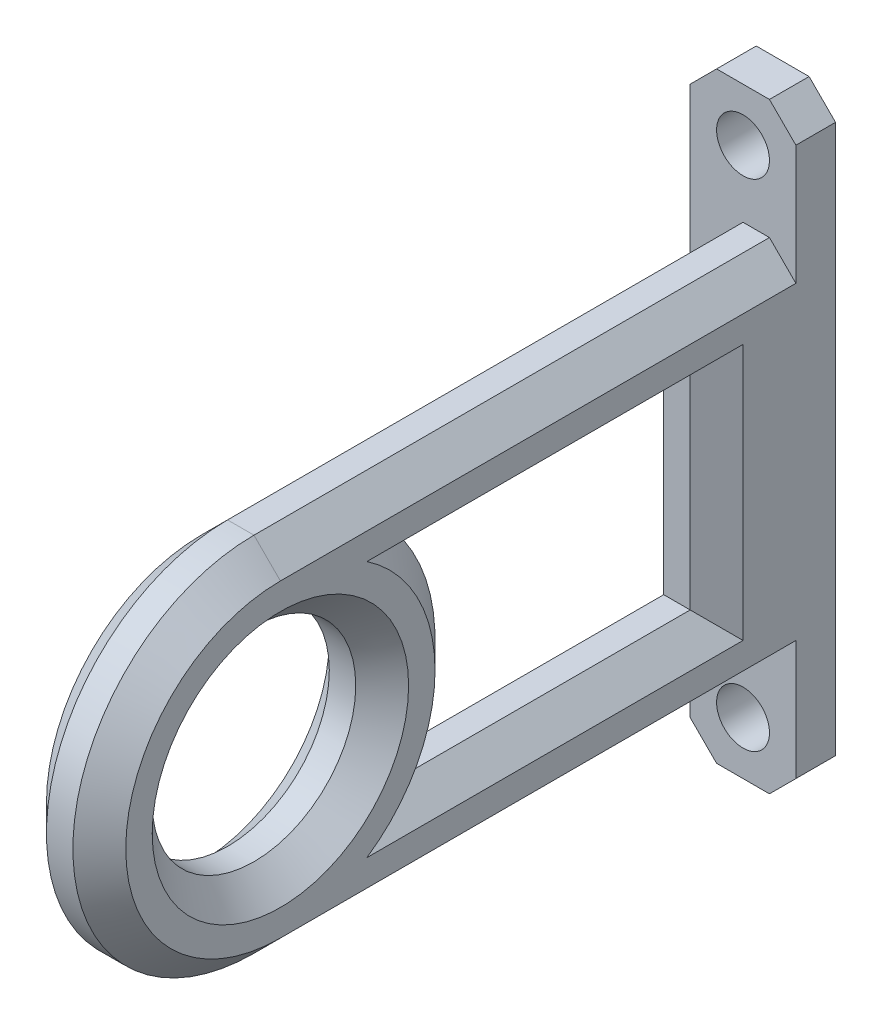
ISO-10303-21;
HEADER;
FILE_DESCRIPTION(('STEP AP214'),'2;1');
FILE_NAME('part.step','',(''),(''),'','','');
FILE_SCHEMA(('AUTOMOTIVE_DESIGN { 1 0 10303 214 1 1 1 1 }'));
ENDSEC;
DATA;
#1=APPLICATION_CONTEXT('core data for automotive mechanical design processes');
#2=APPLICATION_PROTOCOL_DEFINITION('international standard','automotive_design',2000,#1);
#3=PRODUCT_CONTEXT('',#1,'mechanical');
#4=PRODUCT('Part','Part','',(#3));
#5=PRODUCT_RELATED_PRODUCT_CATEGORY('part','',(#4));
#6=PRODUCT_DEFINITION_FORMATION('','',#4);
#7=PRODUCT_DEFINITION_CONTEXT('part definition',#1,'design');
#8=PRODUCT_DEFINITION('design','',#6,#7);
#9=PRODUCT_DEFINITION_SHAPE('','',#8);
#10=(LENGTH_UNIT() NAMED_UNIT(*) SI_UNIT(.MILLI.,.METRE.));
#11=(NAMED_UNIT(*) PLANE_ANGLE_UNIT() SI_UNIT($,.RADIAN.));
#12=(NAMED_UNIT(*) SI_UNIT($,.STERADIAN.) SOLID_ANGLE_UNIT());
#13=UNCERTAINTY_MEASURE_WITH_UNIT(LENGTH_MEASURE(1.E-05),#10,'distance_accuracy_value','');
#14=(GEOMETRIC_REPRESENTATION_CONTEXT(3) GLOBAL_UNCERTAINTY_ASSIGNED_CONTEXT((#13)) GLOBAL_UNIT_ASSIGNED_CONTEXT((#10,
#11,#12)) REPRESENTATION_CONTEXT('',''));
#15=CARTESIAN_POINT('',(0.,0.,0.));
#16=DIRECTION('',(0.,0.,1.));
#17=DIRECTION('',(1.,0.,0.));
#18=AXIS2_PLACEMENT_3D('',#15,#16,#17);
#19=CARTESIAN_POINT('',(6.,0.,0.));
#20=DIRECTION('',(1.,0.,0.));
#21=DIRECTION('',(0.,0.,-1.));
#22=AXIS2_PLACEMENT_3D('',#19,#20,#21);
#23=PLANE('',#22);
#24=CARTESIAN_POINT('',(6.,0.,0.));
#25=DIRECTION('',(1.,0.,0.));
#26=DIRECTION('',(0.,0.,-1.));
#27=AXIS2_PLACEMENT_3D('',#24,#25,#26);
#28=CIRCLE('',#27,9.70000000000024);
#29=CARTESIAN_POINT('',(6.,0.,-9.70000000000024));
#30=VERTEX_POINT('',#29);
#31=EDGE_CURVE('E209',#30,#30,#28,.F.);
#32=ORIENTED_EDGE('',*,*,#31,.T.);
#33=EDGE_LOOP('',(#32));
#34=FACE_BOUND('',#33,.T.);
#35=DIRECTION('',(0.,0.,1.));
#36=VECTOR('',#35,1.);
#37=CARTESIAN_POINT('',(6.,-9.70000000000157,-1.52204206480904E-13));
#38=LINE('',#37,#36);
#39=CARTESIAN_POINT('',(6.,-9.70000000000103,-34.9999999999993));
#40=VERTEX_POINT('',#39);
#41=CARTESIAN_POINT('',(6.,-9.70000000000147,-6.54217089351876));
#42=VERTEX_POINT('',#41);
#43=EDGE_CURVE('E474',#40,#42,#38,.T.);
#44=ORIENTED_EDGE('',*,*,#43,.T.);
#45=CARTESIAN_POINT('',(6.,0.,0.));
#46=DIRECTION('',(1.,0.,0.));
#47=DIRECTION('',(0.,0.,-1.));
#48=AXIS2_PLACEMENT_3D('',#45,#46,#47);
#49=CIRCLE('',#48,11.7000000000014);
#50=CARTESIAN_POINT('',(6.,9.70000000000147,-6.54217089351876));
#51=VERTEX_POINT('',#50);
#52=EDGE_CURVE('E476',#42,#51,#49,.T.);
#53=ORIENTED_EDGE('',*,*,#52,.T.);
#54=DIRECTION('',(0.,0.,-1.));
#55=VECTOR('',#54,1.);
#56=CARTESIAN_POINT('',(6.,9.70000000000157,-1.52204206480904E-13));
#57=LINE('',#56,#55);
#58=CARTESIAN_POINT('',(6.,9.70000000000103,-34.9999999999993));
#59=VERTEX_POINT('',#58);
#60=EDGE_CURVE('E243',#51,#59,#57,.T.);
#61=ORIENTED_EDGE('',*,*,#60,.T.);
#62=DIRECTION('',(0.,-1.,0.));
#63=VECTOR('',#62,1.);
#64=CARTESIAN_POINT('',(6.,0.,-34.9999999999993));
#65=LINE('',#64,#63);
#66=EDGE_CURVE('E472',#59,#40,#65,.T.);
#67=ORIENTED_EDGE('',*,*,#66,.T.);
#68=EDGE_LOOP('',(#44,#53,#61,#67));
#69=FACE_BOUND('',#68,.T.);
#70=DIRECTION('',(0.,-1.,0.));
#71=VECTOR('',#70,1.);
#72=CARTESIAN_POINT('',(6.,-22.7499999999908,-38.9999999999993));
#73=LINE('',#72,#71);
#74=CARTESIAN_POINT('',(6.,-11.7000000000011,-38.9999999999993));
#75=VERTEX_POINT('',#74);
#76=CARTESIAN_POINT('',(6.,-20.7499999999908,-38.9999999999993));
#77=VERTEX_POINT('',#76);
#78=EDGE_CURVE('E226',#75,#77,#73,.T.);
#79=ORIENTED_EDGE('',*,*,#78,.T.);
#80=DIRECTION('',(0.,0.,-1.));
#81=VECTOR('',#80,1.);
#82=CARTESIAN_POINT('',(6.,-20.7499999999908,-41.9999999999993));
#83=LINE('',#82,#81);
#84=CARTESIAN_POINT('',(6.,-20.7499999999908,-41.9999999999993));
#85=VERTEX_POINT('',#84);
#86=EDGE_CURVE('E719',#77,#85,#83,.T.);
#87=ORIENTED_EDGE('',*,*,#86,.T.);
#88=DIRECTION('',(0.,-1.,0.));
#89=VECTOR('',#88,1.);
#90=CARTESIAN_POINT('',(6.,-22.7499999999908,-41.9999999999993));
#91=LINE('',#90,#89);
#92=CARTESIAN_POINT('',(6.00000000000001,20.7499999999908,-41.9999999999993));
#93=VERTEX_POINT('',#92);
#94=EDGE_CURVE('E688',#93,#85,#91,.T.);
#95=ORIENTED_EDGE('',*,*,#94,.F.);
#96=DIRECTION('',(0.,0.,1.));
#97=VECTOR('',#96,1.);
#98=CARTESIAN_POINT('',(6.,20.7499999999908,-38.9999999999993));
#99=LINE('',#98,#97);
#100=CARTESIAN_POINT('',(6.00000000000001,20.7499999999908,-38.9999999999993));
#101=VERTEX_POINT('',#100);
#102=EDGE_CURVE('E716',#93,#101,#99,.T.);
#103=ORIENTED_EDGE('',*,*,#102,.T.);
#104=CARTESIAN_POINT('',(6.,11.7000000000011,-38.9999999999993));
#105=VERTEX_POINT('',#104);
#106=EDGE_CURVE('E703',#101,#105,#73,.T.);
#107=ORIENTED_EDGE('',*,*,#106,.T.);
#108=DIRECTION('',(0.,0.,1.));
#109=VECTOR('',#108,1.);
#110=CARTESIAN_POINT('',(6.,11.7000000000009,0.));
#111=LINE('',#110,#109);
#112=CARTESIAN_POINT('',(6.,11.7000000000009,0.));
#113=VERTEX_POINT('',#112);
#114=EDGE_CURVE('E248',#105,#113,#111,.T.);
#115=ORIENTED_EDGE('',*,*,#114,.T.);
#116=CARTESIAN_POINT('',(6.,0.,0.));
#117=DIRECTION('',(1.,0.,0.));
#118=DIRECTION('',(0.,0.,-1.));
#119=AXIS2_PLACEMENT_3D('',#116,#117,#118);
#120=CIRCLE('',#119,11.7000000000009);
#121=CARTESIAN_POINT('',(6.,-11.7000000000009,0.));
#122=VERTEX_POINT('',#121);
#123=EDGE_CURVE('E244',#113,#122,#120,.T.);
#124=ORIENTED_EDGE('',*,*,#123,.T.);
#125=DIRECTION('',(0.,0.,-1.));
#126=VECTOR('',#125,1.);
#127=CARTESIAN_POINT('',(6.,-11.7000000000011,-38.9999999999993));
#128=LINE('',#127,#126);
#129=EDGE_CURVE('E241',#122,#75,#128,.T.);
#130=ORIENTED_EDGE('',*,*,#129,.T.);
#131=EDGE_LOOP('',(#79,#87,#95,#103,#107,#115,#124,#130));
#132=FACE_BOUND('',#131,.T.);
#133=ADVANCED_FACE('F35',(#34,#69,#132),#23,.T.);
#134=CARTESIAN_POINT('',(0.,0.,0.));
#135=DIRECTION('',(1.,0.,0.));
#136=DIRECTION('',(0.,0.,-1.));
#137=AXIS2_PLACEMENT_3D('',#134,#135,#136);
#138=PLANE('',#137);
#139=CARTESIAN_POINT('',(0.,0.,0.));
#140=DIRECTION('',(1.,0.,0.));
#141=DIRECTION('',(0.,0.,-1.));
#142=AXIS2_PLACEMENT_3D('',#139,#140,#141);
#143=CIRCLE('',#142,9.70000000000022);
#144=CARTESIAN_POINT('',(0.,0.,-9.70000000000022));
#145=VERTEX_POINT('',#144);
#146=EDGE_CURVE('E461',#145,#145,#143,.T.);
#147=ORIENTED_EDGE('',*,*,#146,.T.);
#148=EDGE_LOOP('',(#147));
#149=FACE_BOUND('',#148,.T.);
#150=CARTESIAN_POINT('',(0.,0.,0.));
#151=DIRECTION('',(1.,0.,0.));
#152=DIRECTION('',(0.,0.,-1.));
#153=AXIS2_PLACEMENT_3D('',#150,#151,#152);
#154=CIRCLE('',#153,11.7000000000014);
#155=CARTESIAN_POINT('',(0.,9.70000000000146,-6.54217089351881));
#156=VERTEX_POINT('',#155);
#157=CARTESIAN_POINT('',(0.,-9.70000000000146,-6.54217089351881));
#158=VERTEX_POINT('',#157);
#159=EDGE_CURVE('E451',#156,#158,#154,.F.);
#160=ORIENTED_EDGE('',*,*,#159,.T.);
#161=DIRECTION('',(0.,0.,-1.));
#162=VECTOR('',#161,1.);
#163=CARTESIAN_POINT('',(0.,-9.70000000000105,-32.9999999999994));
#164=LINE('',#163,#162);
#165=CARTESIAN_POINT('',(0.,-9.70000000000102,-34.9999999999993));
#166=VERTEX_POINT('',#165);
#167=EDGE_CURVE('E453',#158,#166,#164,.T.);
#168=ORIENTED_EDGE('',*,*,#167,.T.);
#169=DIRECTION('',(0.,1.,0.));
#170=VECTOR('',#169,1.);
#171=CARTESIAN_POINT('',(0.,7.70000000000106,-34.9999999999993));
#172=LINE('',#171,#170);
#173=CARTESIAN_POINT('',(0.,9.70000000000102,-34.9999999999993));
#174=VERTEX_POINT('',#173);
#175=EDGE_CURVE('E449',#166,#174,#172,.T.);
#176=ORIENTED_EDGE('',*,*,#175,.T.);
#177=DIRECTION('',(0.,0.,1.));
#178=VECTOR('',#177,1.);
#179=CARTESIAN_POINT('',(0.,9.70000000000139,-11.331372379373));
#180=LINE('',#179,#178);
#181=EDGE_CURVE('E447',#174,#156,#180,.T.);
#182=ORIENTED_EDGE('',*,*,#181,.T.);
#183=EDGE_LOOP('',(#160,#168,#176,#182));
#184=FACE_BOUND('',#183,.T.);
#185=DIRECTION('',(0.,1.,0.));
#186=VECTOR('',#185,1.);
#187=CARTESIAN_POINT('',(0.,-13.7000000000011,-38.9999999999993));
#188=LINE('',#187,#186);
#189=CARTESIAN_POINT('',(0.,-11.7000000000011,-38.9999999999993));
#190=VERTEX_POINT('',#189);
#191=CARTESIAN_POINT('',(0.,11.7000000000011,-38.9999999999993));
#192=VERTEX_POINT('',#191);
#193=EDGE_CURVE('E432',#190,#192,#188,.T.);
#194=ORIENTED_EDGE('',*,*,#193,.F.);
#195=DIRECTION('',(0.,0.,1.));
#196=VECTOR('',#195,1.);
#197=CARTESIAN_POINT('',(0.,-11.7000000000009,0.));
#198=LINE('',#197,#196);
#199=CARTESIAN_POINT('',(0.,-11.7000000000009,0.));
#200=VERTEX_POINT('',#199);
#201=EDGE_CURVE('E459',#190,#200,#198,.T.);
#202=ORIENTED_EDGE('',*,*,#201,.T.);
#203=CARTESIAN_POINT('',(0.,0.,0.));
#204=DIRECTION('',(1.,0.,0.));
#205=DIRECTION('',(0.,0.,-1.));
#206=AXIS2_PLACEMENT_3D('',#203,#204,#205);
#207=CIRCLE('',#206,11.7000000000009);
#208=CARTESIAN_POINT('',(0.,11.7000000000009,0.));
#209=VERTEX_POINT('',#208);
#210=EDGE_CURVE('E457',#200,#209,#207,.F.);
#211=ORIENTED_EDGE('',*,*,#210,.T.);
#212=DIRECTION('',(0.,0.,-1.));
#213=VECTOR('',#212,1.);
#214=CARTESIAN_POINT('',(0.,11.7000000000009,0.));
#215=LINE('',#214,#213);
#216=EDGE_CURVE('E430',#209,#192,#215,.T.);
#217=ORIENTED_EDGE('',*,*,#216,.T.);
#218=EDGE_LOOP('',(#194,#202,#211,#217));
#219=FACE_BOUND('',#218,.T.);
#220=ADVANCED_FACE('F381',(#149,#184,#219),#138,.F.);
#221=CARTESIAN_POINT('',(6.,0.,0.));
#222=DIRECTION('',(-1.,0.,0.));
#223=DIRECTION('',(0.,0.,1.));
#224=AXIS2_PLACEMENT_3D('',#221,#222,#223);
#225=CYLINDRICAL_SURFACE('',#224,13.7000000000009);
#226=DIRECTION('',(-1.,0.,0.));
#227=VECTOR('',#226,1.);
#228=CARTESIAN_POINT('',(6.,13.7000000000009,0.));
#229=LINE('',#228,#227);
#230=CARTESIAN_POINT('',(4.00000000000001,13.7000000000009,0.));
#231=VERTEX_POINT('',#230);
#232=CARTESIAN_POINT('',(1.99999999999999,13.7000000000009,0.));
#233=VERTEX_POINT('',#232);
#234=EDGE_CURVE('E435',#231,#233,#229,.T.);
#235=ORIENTED_EDGE('',*,*,#234,.T.);
#236=CARTESIAN_POINT('',(1.99999999999999,0.,0.));
#237=DIRECTION('',(1.,0.,0.));
#238=DIRECTION('',(0.,0.,-1.));
#239=AXIS2_PLACEMENT_3D('',#236,#237,#238);
#240=CIRCLE('',#239,13.7000000000009);
#241=CARTESIAN_POINT('',(1.99999999999999,-13.7000000000009,0.));
#242=VERTEX_POINT('',#241);
#243=EDGE_CURVE('E256',#233,#242,#240,.T.);
#244=ORIENTED_EDGE('',*,*,#243,.T.);
#245=DIRECTION('',(-1.,0.,0.));
#246=VECTOR('',#245,1.);
#247=CARTESIAN_POINT('',(6.,-13.7000000000009,0.));
#248=LINE('',#247,#246);
#249=CARTESIAN_POINT('',(4.00000000000001,-13.7000000000009,0.));
#250=VERTEX_POINT('',#249);
#251=EDGE_CURVE('E218',#250,#242,#248,.T.);
#252=ORIENTED_EDGE('',*,*,#251,.F.);
#253=CARTESIAN_POINT('',(4.00000000000001,0.,0.));
#254=DIRECTION('',(1.,0.,0.));
#255=DIRECTION('',(0.,0.,-1.));
#256=AXIS2_PLACEMENT_3D('',#253,#254,#255);
#257=CIRCLE('',#256,13.7000000000009);
#258=EDGE_CURVE('E254',#250,#231,#257,.F.);
#259=ORIENTED_EDGE('',*,*,#258,.T.);
#260=EDGE_LOOP('',(#235,#244,#252,#259));
#261=FACE_BOUND('',#260,.T.);
#262=ADVANCED_FACE('F387',(#261),#225,.T.);
#263=CARTESIAN_POINT('',(6.,-13.7000000000009,0.));
#264=DIRECTION('',(0.,1.,0.));
#265=DIRECTION('',(0.,0.,1.));
#266=AXIS2_PLACEMENT_3D('',#263,#264,#265);
#267=PLANE('',#266);
#268=ORIENTED_EDGE('',*,*,#251,.T.);
#269=DIRECTION('',(0.,0.,-1.));
#270=VECTOR('',#269,1.);
#271=CARTESIAN_POINT('',(1.99999999999999,-13.7000000000009,0.));
#272=LINE('',#271,#270);
#273=CARTESIAN_POINT('',(2.,-13.7000000000011,-38.9999999999993));
#274=VERTEX_POINT('',#273);
#275=EDGE_CURVE('E208',#242,#274,#272,.T.);
#276=ORIENTED_EDGE('',*,*,#275,.T.);
#277=DIRECTION('',(-1.,0.,0.));
#278=VECTOR('',#277,1.);
#279=CARTESIAN_POINT('',(6.,-13.7000000000011,-38.9999999999993));
#280=LINE('',#279,#278);
#281=CARTESIAN_POINT('',(4.00000000000001,-13.7000000000011,-38.9999999999993));
#282=VERTEX_POINT('',#281);
#283=EDGE_CURVE('E213',#282,#274,#280,.T.);
#284=ORIENTED_EDGE('',*,*,#283,.F.);
#285=DIRECTION('',(0.,0.,1.));
#286=VECTOR('',#285,1.);
#287=CARTESIAN_POINT('',(4.00000000000001,-13.7000000000009,0.));
#288=LINE('',#287,#286);
#289=EDGE_CURVE('E196',#282,#250,#288,.T.);
#290=ORIENTED_EDGE('',*,*,#289,.T.);
#291=EDGE_LOOP('',(#268,#276,#284,#290));
#292=FACE_BOUND('',#291,.T.);
#293=ADVANCED_FACE('F214',(#292),#267,.F.);
#294=CARTESIAN_POINT('',(6.,13.7000000000009,0.));
#295=DIRECTION('',(0.,-1.,0.));
#296=DIRECTION('',(0.,0.,-1.));
#297=AXIS2_PLACEMENT_3D('',#294,#295,#296);
#298=PLANE('',#297);
#299=DIRECTION('',(-1.,0.,0.));
#300=VECTOR('',#299,1.);
#301=CARTESIAN_POINT('',(6.,13.7000000000011,-38.9999999999993));
#302=LINE('',#301,#300);
#303=CARTESIAN_POINT('',(4.00000000000001,13.7000000000011,-38.9999999999993));
#304=VERTEX_POINT('',#303);
#305=CARTESIAN_POINT('',(2.,13.7000000000011,-38.9999999999993));
#306=VERTEX_POINT('',#305);
#307=EDGE_CURVE('E219',#304,#306,#302,.T.);
#308=ORIENTED_EDGE('',*,*,#307,.T.);
#309=DIRECTION('',(0.,0.,1.));
#310=VECTOR('',#309,1.);
#311=CARTESIAN_POINT('',(1.99999999999999,13.7000000000009,0.));
#312=LINE('',#311,#310);
#313=EDGE_CURVE('E260',#306,#233,#312,.T.);
#314=ORIENTED_EDGE('',*,*,#313,.T.);
#315=ORIENTED_EDGE('',*,*,#234,.F.);
#316=DIRECTION('',(0.,0.,-1.));
#317=VECTOR('',#316,1.);
#318=CARTESIAN_POINT('',(4.00000000000001,13.7000000000011,-38.9999999999993));
#319=LINE('',#318,#317);
#320=EDGE_CURVE('E258',#231,#304,#319,.T.);
#321=ORIENTED_EDGE('',*,*,#320,.T.);
#322=EDGE_LOOP('',(#308,#314,#315,#321));
#323=FACE_BOUND('',#322,.T.);
#324=ADVANCED_FACE('F396',(#323),#298,.F.);
#325=CARTESIAN_POINT('',(6.,-7.70000000000106,-32.9999999999993));
#326=DIRECTION('',(0.,0.,1.));
#327=DIRECTION('',(1.,0.,0.));
#328=AXIS2_PLACEMENT_3D('',#325,#326,#327);
#329=PLANE('',#328);
#330=DIRECTION('',(-1.,0.,0.));
#331=VECTOR('',#330,1.);
#332=CARTESIAN_POINT('',(6.,7.70000000000106,-32.9999999999993));
#333=LINE('',#332,#331);
#334=CARTESIAN_POINT('',(4.00000000000001,7.70000000000106,-32.9999999999993));
#335=VERTEX_POINT('',#334);
#336=CARTESIAN_POINT('',(1.99999999999999,7.70000000000106,-32.9999999999993));
#337=VERTEX_POINT('',#336);
#338=EDGE_CURVE('E436',#335,#337,#333,.T.);
#339=ORIENTED_EDGE('',*,*,#338,.T.);
#340=DIRECTION('',(0.,-1.,0.));
#341=VECTOR('',#340,1.);
#342=CARTESIAN_POINT('',(1.99999999999999,-7.70000000000106,-32.9999999999993));
#343=LINE('',#342,#341);
#344=CARTESIAN_POINT('',(1.99999999999999,-7.70000000000106,-32.9999999999993));
#345=VERTEX_POINT('',#344);
#346=EDGE_CURVE('E274',#337,#345,#343,.T.);
#347=ORIENTED_EDGE('',*,*,#346,.T.);
#348=DIRECTION('',(-1.,0.,0.));
#349=VECTOR('',#348,1.);
#350=CARTESIAN_POINT('',(6.,-7.70000000000106,-32.9999999999993));
#351=LINE('',#350,#349);
#352=CARTESIAN_POINT('',(4.00000000000001,-7.70000000000106,-32.9999999999993));
#353=VERTEX_POINT('',#352);
#354=EDGE_CURVE('E288',#353,#345,#351,.T.);
#355=ORIENTED_EDGE('',*,*,#354,.F.);
#356=DIRECTION('',(0.,1.,0.));
#357=VECTOR('',#356,1.);
#358=CARTESIAN_POINT('',(4.00000000000001,-7.70000000000106,-32.9999999999993));
#359=LINE('',#358,#357);
#360=EDGE_CURVE('E272',#353,#335,#359,.T.);
#361=ORIENTED_EDGE('',*,*,#360,.T.);
#362=EDGE_LOOP('',(#339,#347,#355,#361));
#363=FACE_BOUND('',#362,.T.);
#364=ADVANCED_FACE('F393',(#363),#329,.T.);
#365=CARTESIAN_POINT('',(6.,7.7000000000014,-11.331372379373));
#366=DIRECTION('',(0.,-1.,0.));
#367=DIRECTION('',(0.,0.,-1.));
#368=AXIS2_PLACEMENT_3D('',#365,#366,#367);
#369=PLANE('',#368);
#370=DIRECTION('',(-1.,0.,0.));
#371=VECTOR('',#370,1.);
#372=CARTESIAN_POINT('',(6.,7.7000000000014,-11.331372379373));
#373=LINE('',#372,#371);
#374=CARTESIAN_POINT('',(4.00000000000001,7.7000000000014,-11.331372379373));
#375=VERTEX_POINT('',#374);
#376=CARTESIAN_POINT('',(1.99999999999999,7.7000000000014,-11.331372379373));
#377=VERTEX_POINT('',#376);
#378=EDGE_CURVE('E441',#375,#377,#373,.T.);
#379=ORIENTED_EDGE('',*,*,#378,.T.);
#380=DIRECTION('',(0.,0.,-1.));
#381=VECTOR('',#380,1.);
#382=CARTESIAN_POINT('',(1.99999999999999,7.70000000000106,-32.9999999999993));
#383=LINE('',#382,#381);
#384=EDGE_CURVE('E278',#377,#337,#383,.T.);
#385=ORIENTED_EDGE('',*,*,#384,.T.);
#386=ORIENTED_EDGE('',*,*,#338,.F.);
#387=DIRECTION('',(0.,0.,1.));
#388=VECTOR('',#387,1.);
#389=CARTESIAN_POINT('',(4.00000000000001,7.7000000000014,-11.331372379373));
#390=LINE('',#389,#388);
#391=EDGE_CURVE('E276',#335,#375,#390,.T.);
#392=ORIENTED_EDGE('',*,*,#391,.T.);
#393=EDGE_LOOP('',(#379,#385,#386,#392));
#394=FACE_BOUND('',#393,.T.);
#395=ADVANCED_FACE('F498',(#394),#369,.T.);
#396=CARTESIAN_POINT('',(6.,0.,0.));
#397=DIRECTION('',(-1.,0.,0.));
#398=DIRECTION('',(0.,0.,1.));
#399=AXIS2_PLACEMENT_3D('',#396,#397,#398);
#400=CYLINDRICAL_SURFACE('',#399,13.7000000000014);
#401=DIRECTION('',(-1.,0.,0.));
#402=VECTOR('',#401,1.);
#403=CARTESIAN_POINT('',(6.,-7.7000000000014,-11.331372379373));
#404=LINE('',#403,#402);
#405=CARTESIAN_POINT('',(4.00000000000001,-7.7000000000014,-11.331372379373));
#406=VERTEX_POINT('',#405);
#407=CARTESIAN_POINT('',(1.99999999999999,-7.7000000000014,-11.331372379373));
#408=VERTEX_POINT('',#407);
#409=EDGE_CURVE('E512',#406,#408,#404,.T.);
#410=ORIENTED_EDGE('',*,*,#409,.T.);
#411=CARTESIAN_POINT('',(1.99999999999999,0.,0.));
#412=DIRECTION('',(1.,0.,0.));
#413=DIRECTION('',(0.,0.,-1.));
#414=AXIS2_PLACEMENT_3D('',#411,#412,#413);
#415=CIRCLE('',#414,13.7000000000014);
#416=EDGE_CURVE('E270',#408,#377,#415,.T.);
#417=ORIENTED_EDGE('',*,*,#416,.T.);
#418=ORIENTED_EDGE('',*,*,#378,.F.);
#419=CARTESIAN_POINT('',(4.00000000000001,0.,0.));
#420=DIRECTION('',(1.,0.,0.));
#421=DIRECTION('',(0.,0.,-1.));
#422=AXIS2_PLACEMENT_3D('',#419,#420,#421);
#423=CIRCLE('',#422,13.7000000000014);
#424=EDGE_CURVE('E267',#375,#406,#423,.F.);
#425=ORIENTED_EDGE('',*,*,#424,.T.);
#426=EDGE_LOOP('',(#410,#417,#418,#425));
#427=FACE_BOUND('',#426,.T.);
#428=ADVANCED_FACE('F490',(#427),#400,.T.);
#429=CARTESIAN_POINT('',(6.,-7.7000000000014,-11.331372379373));
#430=DIRECTION('',(0.,1.,0.));
#431=DIRECTION('',(0.,0.,1.));
#432=AXIS2_PLACEMENT_3D('',#429,#430,#431);
#433=PLANE('',#432);
#434=ORIENTED_EDGE('',*,*,#354,.T.);
#435=DIRECTION('',(0.,0.,1.));
#436=VECTOR('',#435,1.);
#437=CARTESIAN_POINT('',(1.99999999999999,-7.7000000000014,-11.331372379373));
#438=LINE('',#437,#436);
#439=EDGE_CURVE('E264',#345,#408,#438,.T.);
#440=ORIENTED_EDGE('',*,*,#439,.T.);
#441=ORIENTED_EDGE('',*,*,#409,.F.);
#442=DIRECTION('',(0.,0.,-1.));
#443=VECTOR('',#442,1.);
#444=CARTESIAN_POINT('',(4.00000000000001,-7.7000000000014,-11.331372379373));
#445=LINE('',#444,#443);
#446=EDGE_CURVE('E262',#406,#353,#445,.T.);
#447=ORIENTED_EDGE('',*,*,#446,.T.);
#448=EDGE_LOOP('',(#434,#440,#441,#447));
#449=FACE_BOUND('',#448,.T.);
#450=ADVANCED_FACE('F484',(#449),#433,.T.);
#451=CARTESIAN_POINT('',(6.,0.,0.));
#452=DIRECTION('',(-1.,0.,0.));
#453=DIRECTION('',(0.,0.,1.));
#454=AXIS2_PLACEMENT_3D('',#451,#452,#453);
#455=CYLINDRICAL_SURFACE('',#454,7.70000000000023);
#456=CARTESIAN_POINT('',(1.99999999999999,0.,0.));
#457=DIRECTION('',(1.,0.,0.));
#458=DIRECTION('',(0.,0.,-1.));
#459=AXIS2_PLACEMENT_3D('',#456,#457,#458);
#460=CIRCLE('',#459,7.70000000000023);
#461=CARTESIAN_POINT('',(1.99999999999999,0.,-7.70000000000023));
#462=VERTEX_POINT('',#461);
#463=EDGE_CURVE('E467',#462,#462,#460,.F.);
#464=ORIENTED_EDGE('',*,*,#463,.T.);
#465=EDGE_LOOP('',(#464));
#466=FACE_BOUND('',#465,.T.);
#467=CARTESIAN_POINT('',(4.,0.,0.));
#468=DIRECTION('',(1.,0.,0.));
#469=DIRECTION('',(0.,0.,-1.));
#470=AXIS2_PLACEMENT_3D('',#467,#468,#469);
#471=CIRCLE('',#470,7.70000000000023);
#472=CARTESIAN_POINT('',(4.,0.,-7.70000000000023));
#473=VERTEX_POINT('',#472);
#474=EDGE_CURVE('E464',#473,#473,#471,.T.);
#475=ORIENTED_EDGE('',*,*,#474,.T.);
#476=EDGE_LOOP('',(#475));
#477=FACE_BOUND('',#476,.T.);
#478=ADVANCED_FACE('F409',(#466,#477),#455,.F.);
#479=CARTESIAN_POINT('',(0.,0.,0.));
#480=DIRECTION('',(-1.,0.,0.));
#481=DIRECTION('',(0.,0.,1.));
#482=AXIS2_PLACEMENT_3D('',#479,#480,#481);
#483=CONICAL_SURFACE('',#482,9.70000000000022,0.785398163397446);
#484=ORIENTED_EDGE('',*,*,#463,.F.);
#485=EDGE_LOOP('',(#484));
#486=FACE_BOUND('',#485,.T.);
#487=ORIENTED_EDGE('',*,*,#146,.F.);
#488=EDGE_LOOP('',(#487));
#489=FACE_BOUND('',#488,.T.);
#490=ADVANCED_FACE('F405',(#486,#489),#483,.F.);
#491=CARTESIAN_POINT('',(4.,0.,0.));
#492=DIRECTION('',(1.,0.,0.));
#493=DIRECTION('',(0.,0.,-1.));
#494=AXIS2_PLACEMENT_3D('',#491,#492,#493);
#495=CONICAL_SURFACE('',#494,7.70000000000023,0.78539816339745);
#496=ORIENTED_EDGE('',*,*,#31,.F.);
#497=EDGE_LOOP('',(#496));
#498=FACE_BOUND('',#497,.T.);
#499=ORIENTED_EDGE('',*,*,#474,.F.);
#500=EDGE_LOOP('',(#499));
#501=FACE_BOUND('',#500,.T.);
#502=ADVANCED_FACE('F408',(#498,#501),#495,.F.);
#503=CARTESIAN_POINT('',(1.99999999999999,13.7000000000009,0.));
#504=DIRECTION('',(0.707106781186549,-0.707106781186546,0.));
#505=DIRECTION('',(0.,0.,1.));
#506=AXIS2_PLACEMENT_3D('',#503,#504,#505);
#507=PLANE('',#506);
#508=DIRECTION('',(-0.707106781186546,-0.707106781186549,0.));
#509=VECTOR('',#508,1.);
#510=CARTESIAN_POINT('',(1.9999999999999,13.700000000001,-38.9999999999993));
#511=LINE('',#510,#509);
#512=EDGE_CURVE('E227',#192,#306,#511,.F.);
#513=ORIENTED_EDGE('',*,*,#512,.F.);
#514=ORIENTED_EDGE('',*,*,#216,.F.);
#515=DIRECTION('',(-0.707106781186546,-0.707106781186549,0.));
#516=VECTOR('',#515,1.);
#517=CARTESIAN_POINT('',(1.99999999999999,13.7000000000009,0.));
#518=LINE('',#517,#516);
#519=EDGE_CURVE('E284',#233,#209,#518,.T.);
#520=ORIENTED_EDGE('',*,*,#519,.F.);
#521=ORIENTED_EDGE('',*,*,#313,.F.);
#522=EDGE_LOOP('',(#513,#514,#520,#521));
#523=FACE_BOUND('',#522,.T.);
#524=ADVANCED_FACE('F413',(#523),#507,.F.);
#525=CARTESIAN_POINT('',(1.99999999999999,0.,0.));
#526=DIRECTION('',(1.,0.,0.));
#527=DIRECTION('',(0.,0.,-1.));
#528=AXIS2_PLACEMENT_3D('',#525,#526,#527);
#529=CONICAL_SURFACE('',#528,13.7000000000009,0.78539816339745);
#530=ORIENTED_EDGE('',*,*,#519,.T.);
#531=ORIENTED_EDGE('',*,*,#210,.F.);
#532=DIRECTION('',(-0.707106781186546,0.707106781186549,0.));
#533=VECTOR('',#532,1.);
#534=CARTESIAN_POINT('',(1.99999999999999,-13.7000000000009,0.));
#535=LINE('',#534,#533);
#536=EDGE_CURVE('E281',#242,#200,#535,.T.);
#537=ORIENTED_EDGE('',*,*,#536,.F.);
#538=ORIENTED_EDGE('',*,*,#243,.F.);
#539=EDGE_LOOP('',(#530,#531,#537,#538));
#540=FACE_BOUND('',#539,.T.);
#541=ADVANCED_FACE('F417',(#540),#529,.T.);
#542=CARTESIAN_POINT('',(1.99999999999999,-13.7000000000009,0.));
#543=DIRECTION('',(0.707106781186549,0.707106781186546,0.));
#544=DIRECTION('',(0.,0.,-1.));
#545=AXIS2_PLACEMENT_3D('',#542,#543,#544);
#546=PLANE('',#545);
#547=ORIENTED_EDGE('',*,*,#536,.T.);
#548=ORIENTED_EDGE('',*,*,#201,.F.);
#549=DIRECTION('',(0.707106781186546,-0.707106781186549,0.));
#550=VECTOR('',#549,1.);
#551=CARTESIAN_POINT('',(1.9999999999999,-13.700000000001,-38.9999999999993));
#552=LINE('',#551,#550);
#553=EDGE_CURVE('E231',#274,#190,#552,.F.);
#554=ORIENTED_EDGE('',*,*,#553,.F.);
#555=ORIENTED_EDGE('',*,*,#275,.F.);
#556=EDGE_LOOP('',(#547,#548,#554,#555));
#557=FACE_BOUND('',#556,.T.);
#558=ADVANCED_FACE('F327',(#557),#546,.F.);
#559=CARTESIAN_POINT('',(0.,9.70000000000156,-1.52204206480904E-13));
#560=DIRECTION('',(-0.707106781186546,-0.707106781186549,0.));
#561=DIRECTION('',(0.,0.,-1.));
#562=AXIS2_PLACEMENT_3D('',#559,#560,#561);
#563=PLANE('',#562);
#564=DIRECTION('',(0.57735026918963,-0.577350269189619,0.577350269189628));
#565=VECTOR('',#564,1.);
#566=CARTESIAN_POINT('',(3.23333333333366,6.46666666666742,-31.7666666666657));
#567=LINE('',#566,#565);
#568=EDGE_CURVE('E299',#337,#174,#567,.F.);
#569=ORIENTED_EDGE('',*,*,#568,.F.);
#570=ORIENTED_EDGE('',*,*,#384,.F.);
#571=CARTESIAN_POINT('',(1.99999999999999,7.7000000000014,-11.331372379373));
#572=CARTESIAN_POINT('',(1.80288845972015,7.89711154028125,-10.9590613292886));
#573=CARTESIAN_POINT('',(1.61190901569892,8.08809098430248,-10.5800856138893));
#574=CARTESIAN_POINT('',(1.24494844146939,8.45505155853202,-9.80978926894103));
#575=CARTESIAN_POINT('',(1.06891829491808,8.63108170508334,-9.4185152435259));
#576=CARTESIAN_POINT('',(0.733093161650863,8.96690683835057,-8.62177800678088));
#577=CARTESIAN_POINT('',(0.573310044504791,9.12668995549665,-8.21630470854151));
#578=CARTESIAN_POINT('',(0.272066238857046,9.4279337611444,-7.39023917497787));
#579=CARTESIAN_POINT('',(0.130670314920811,9.56932968508064,-6.96959982740123));
#580=CARTESIAN_POINT('',(0.,9.70000000000146,-6.54217089351881));
#581=B_SPLINE_CURVE_WITH_KNOTS('',3,(#571,#572,#573,#574,#575,#576,#577,#578,#579,#580),
.UNSPECIFIED.,.F.,.F.,(4,2,2,2,4),(0.,1.39538108798869,2.78599446863604,4.17761659659731,
5.5740147691987),.UNSPECIFIED.);
#582=EDGE_CURVE('E285',#156,#377,#581,.F.);
#583=ORIENTED_EDGE('',*,*,#582,.F.);
#584=ORIENTED_EDGE('',*,*,#181,.F.);
#585=EDGE_LOOP('',(#569,#570,#583,#584));
#586=FACE_BOUND('',#585,.T.);
#587=ADVANCED_FACE('F309',(#586),#563,.T.);
#588=CARTESIAN_POINT('',(0.,0.,0.));
#589=DIRECTION('',(1.,0.,0.));
#590=DIRECTION('',(0.,0.,-1.));
#591=AXIS2_PLACEMENT_3D('',#588,#589,#590);
#592=CONICAL_SURFACE('',#591,11.7000000000014,0.785398163397447);
#593=ORIENTED_EDGE('',*,*,#582,.T.);
#594=ORIENTED_EDGE('',*,*,#416,.F.);
#595=CARTESIAN_POINT('',(1.99999999999999,-7.7000000000014,-11.331372379373));
#596=CARTESIAN_POINT('',(1.80288845972015,-7.89711154028125,-10.9590613292886));
#597=CARTESIAN_POINT('',(1.61190901569892,-8.08809098430249,-10.5800856138893));
#598=CARTESIAN_POINT('',(1.24494844146939,-8.45505155853202,-9.80978926894102));
#599=CARTESIAN_POINT('',(1.06891829491808,-8.63108170508333,-9.4185152435259));
#600=CARTESIAN_POINT('',(0.733093161650863,-8.96690683835057,-8.62177800678088));
#601=CARTESIAN_POINT('',(0.573310044504791,-9.12668995549665,-8.21630470854151));
#602=CARTESIAN_POINT('',(0.272066238857046,-9.4279337611444,-7.39023917497787));
#603=CARTESIAN_POINT('',(0.130670314920811,-9.56932968508064,-6.96959982740123));
#604=CARTESIAN_POINT('',(0.,-9.70000000000146,-6.54217089351881));
#605=B_SPLINE_CURVE_WITH_KNOTS('',3,(#595,#596,#597,#598,#599,#600,#601,#602,#603,#604),
.UNSPECIFIED.,.F.,.F.,(4,2,2,2,4),(0.,1.39538108798868,2.78599446863604,4.1776165965973,
5.57401476919869),.UNSPECIFIED.);
#606=EDGE_CURVE('E291',#158,#408,#605,.F.);
#607=ORIENTED_EDGE('',*,*,#606,.F.);
#608=ORIENTED_EDGE('',*,*,#159,.F.);
#609=EDGE_LOOP('',(#593,#594,#607,#608));
#610=FACE_BOUND('',#609,.T.);
#611=ADVANCED_FACE('F304',(#610),#592,.T.);
#612=CARTESIAN_POINT('',(0.,0.,-34.9999999999993));
#613=DIRECTION('',(-0.707106781186546,0.,0.707106781186549));
#614=DIRECTION('',(0.,-1.,0.));
#615=AXIS2_PLACEMENT_3D('',#612,#613,#614);
#616=PLANE('',#615);
#617=ORIENTED_EDGE('',*,*,#568,.T.);
#618=ORIENTED_EDGE('',*,*,#175,.F.);
#619=DIRECTION('',(0.57735026918963,0.577350269189619,0.577350269189628));
#620=VECTOR('',#619,1.);
#621=CARTESIAN_POINT('',(11.6666666666663,1.9666666666651,-23.333333333333));
#622=LINE('',#621,#620);
#623=EDGE_CURVE('E289',#345,#166,#622,.F.);
#624=ORIENTED_EDGE('',*,*,#623,.F.);
#625=ORIENTED_EDGE('',*,*,#346,.F.);
#626=EDGE_LOOP('',(#617,#618,#624,#625));
#627=FACE_BOUND('',#626,.T.);
#628=ADVANCED_FACE('F308',(#627),#616,.T.);
#629=CARTESIAN_POINT('',(0.,-9.70000000000156,-1.52204206480904E-13));
#630=DIRECTION('',(-0.707106781186546,0.707106781186549,0.));
#631=DIRECTION('',(0.,0.,1.));
#632=AXIS2_PLACEMENT_3D('',#629,#630,#631);
#633=PLANE('',#632);
#634=ORIENTED_EDGE('',*,*,#606,.T.);
#635=ORIENTED_EDGE('',*,*,#439,.F.);
#636=ORIENTED_EDGE('',*,*,#623,.T.);
#637=ORIENTED_EDGE('',*,*,#167,.F.);
#638=EDGE_LOOP('',(#634,#635,#636,#637));
#639=FACE_BOUND('',#638,.T.);
#640=ADVANCED_FACE('F301',(#639),#633,.T.);
#641=CARTESIAN_POINT('',(4.00000000000001,-7.70000000000106,-32.9999999999993));
#642=DIRECTION('',(-0.707106781186549,0.,-0.707106781186546));
#643=DIRECTION('',(0.,1.,0.));
#644=AXIS2_PLACEMENT_3D('',#641,#642,#643);
#645=PLANE('',#644);
#646=DIRECTION('',(0.577350269189627,-0.57735026918962,-0.57735026918963));
#647=VECTOR('',#646,1.);
#648=CARTESIAN_POINT('',(-3.22287587354207,-0.477124126459072,-25.7771241264572));
#649=LINE('',#648,#647);
#650=EDGE_CURVE('E343',#40,#353,#649,.F.);
#651=ORIENTED_EDGE('',*,*,#650,.F.);
#652=ORIENTED_EDGE('',*,*,#66,.F.);
#653=DIRECTION('',(0.577350269189628,0.57735026918962,-0.57735026918963));
#654=VECTOR('',#653,1.);
#655=CARTESIAN_POINT('',(-1.133333333334,2.56666666666712,-27.8666666666653));
#656=LINE('',#655,#654);
#657=EDGE_CURVE('E292',#335,#59,#656,.T.);
#658=ORIENTED_EDGE('',*,*,#657,.F.);
#659=ORIENTED_EDGE('',*,*,#360,.F.);
#660=EDGE_LOOP('',(#651,#652,#658,#659));
#661=FACE_BOUND('',#660,.T.);
#662=ADVANCED_FACE('F349',(#661),#645,.F.);
#663=CARTESIAN_POINT('',(4.00000000000001,7.7000000000014,-11.331372379373));
#664=DIRECTION('',(-0.707106781186549,0.707106781186546,0.));
#665=DIRECTION('',(0.,0.,1.));
#666=AXIS2_PLACEMENT_3D('',#663,#664,#665);
#667=PLANE('',#666);
#668=ORIENTED_EDGE('',*,*,#657,.T.);
#669=ORIENTED_EDGE('',*,*,#60,.F.);
#670=CARTESIAN_POINT('',(6.,9.70000000000147,-6.54217089351876));
#671=CARTESIAN_POINT('',(5.86932968507919,9.56932968508066,-6.96959982740119));
#672=CARTESIAN_POINT('',(5.72793376114296,9.42793376114441,-7.39023917497783));
#673=CARTESIAN_POINT('',(5.42668995549521,9.12668995549666,-8.21630470854148));
#674=CARTESIAN_POINT('',(5.26690683834914,8.96690683835058,-8.62177800678085));
#675=CARTESIAN_POINT('',(4.93108170508192,8.63108170508334,-9.41851524352588));
#676=CARTESIAN_POINT('',(4.75505155853061,8.45505155853203,-9.80978926894101));
#677=CARTESIAN_POINT('',(4.38809098430108,8.08809098430249,-10.5800856138893));
#678=CARTESIAN_POINT('',(4.19711154027985,7.89711154028125,-10.9590613292886));
#679=CARTESIAN_POINT('',(4.00000000000001,7.7000000000014,-11.331372379373));
#680=B_SPLINE_CURVE_WITH_KNOTS('',3,(#670,#671,#672,#673,#674,#675,#676,#677,#678,#679),
.UNSPECIFIED.,.F.,.F.,(4,2,2,2,4),(0.,1.3963981726014,2.78802030056268,4.17863368121005,
5.57401476919874),.UNSPECIFIED.);
#681=EDGE_CURVE('E338',#375,#51,#680,.F.);
#682=ORIENTED_EDGE('',*,*,#681,.F.);
#683=ORIENTED_EDGE('',*,*,#391,.F.);
#684=EDGE_LOOP('',(#668,#669,#682,#683));
#685=FACE_BOUND('',#684,.T.);
#686=ADVANCED_FACE('F345',(#685),#667,.F.);
#687=CARTESIAN_POINT('',(4.00000000000001,-7.7000000000014,-11.331372379373));
#688=DIRECTION('',(-0.707106781186549,-0.707106781186546,0.));
#689=DIRECTION('',(0.,0.,-1.));
#690=AXIS2_PLACEMENT_3D('',#687,#688,#689);
#691=PLANE('',#690);
#692=ORIENTED_EDGE('',*,*,#650,.T.);
#693=ORIENTED_EDGE('',*,*,#446,.F.);
#694=CARTESIAN_POINT('',(4.00000000000001,-7.7000000000014,-11.331372379373));
#695=CARTESIAN_POINT('',(4.19711154027985,-7.89711154028125,-10.9590613292886));
#696=CARTESIAN_POINT('',(4.38809098430108,-8.08809098430249,-10.5800856138893));
#697=CARTESIAN_POINT('',(4.75505155853061,-8.45505155853203,-9.80978926894101));
#698=CARTESIAN_POINT('',(4.93108170508192,-8.63108170508334,-9.41851524352588));
#699=CARTESIAN_POINT('',(5.26690683834914,-8.96690683835058,-8.62177800678085));
#700=CARTESIAN_POINT('',(5.42668995549521,-9.12668995549666,-8.21630470854148));
#701=CARTESIAN_POINT('',(5.72793376114295,-9.42793376114441,-7.39023917497783));
#702=CARTESIAN_POINT('',(5.86932968507919,-9.56932968508066,-6.96959982740119));
#703=CARTESIAN_POINT('',(6.,-9.70000000000147,-6.54217089351877));
#704=B_SPLINE_CURVE_WITH_KNOTS('',3,(#694,#695,#696,#697,#698,#699,#700,#701,#702,#703),
.UNSPECIFIED.,.F.,.F.,(4,2,2,2,4),(0.,1.39538108798869,2.78599446863606,4.17761659659734,
5.57401476919873),.UNSPECIFIED.);
#705=EDGE_CURVE('E318',#42,#406,#704,.F.);
#706=ORIENTED_EDGE('',*,*,#705,.F.);
#707=ORIENTED_EDGE('',*,*,#43,.F.);
#708=EDGE_LOOP('',(#692,#693,#706,#707));
#709=FACE_BOUND('',#708,.T.);
#710=ADVANCED_FACE('F333',(#709),#691,.F.);
#711=CARTESIAN_POINT('',(4.00000000000001,0.,0.));
#712=DIRECTION('',(-1.,0.,0.));
#713=DIRECTION('',(0.,0.,1.));
#714=AXIS2_PLACEMENT_3D('',#711,#712,#713);
#715=CONICAL_SURFACE('',#714,13.7000000000014,0.78539816339745);
#716=ORIENTED_EDGE('',*,*,#681,.T.);
#717=ORIENTED_EDGE('',*,*,#52,.F.);
#718=ORIENTED_EDGE('',*,*,#705,.T.);
#719=ORIENTED_EDGE('',*,*,#424,.F.);
#720=EDGE_LOOP('',(#716,#717,#718,#719));
#721=FACE_BOUND('',#720,.T.);
#722=ADVANCED_FACE('F329',(#721),#715,.T.);
#723=CARTESIAN_POINT('',(6.,11.7000000000009,0.));
#724=DIRECTION('',(0.707106781186546,0.707106781186549,0.));
#725=DIRECTION('',(0.,0.,-1.));
#726=AXIS2_PLACEMENT_3D('',#723,#724,#725);
#727=PLANE('',#726);
#728=DIRECTION('',(0.707106781186549,-0.707106781186546,0.));
#729=VECTOR('',#728,1.);
#730=CARTESIAN_POINT('',(6.0000000000001,11.700000000001,-38.9999999999993));
#731=LINE('',#730,#729);
#732=EDGE_CURVE('E228',#304,#105,#731,.T.);
#733=ORIENTED_EDGE('',*,*,#732,.F.);
#734=ORIENTED_EDGE('',*,*,#320,.F.);
#735=DIRECTION('',(-0.707106781186549,0.707106781186546,0.));
#736=VECTOR('',#735,1.);
#737=CARTESIAN_POINT('',(6.,11.7000000000009,0.));
#738=LINE('',#737,#736);
#739=EDGE_CURVE('E237',#113,#231,#738,.T.);
#740=ORIENTED_EDGE('',*,*,#739,.F.);
#741=ORIENTED_EDGE('',*,*,#114,.F.);
#742=EDGE_LOOP('',(#733,#734,#740,#741));
#743=FACE_BOUND('',#742,.T.);
#744=ADVANCED_FACE('F332',(#743),#727,.T.);
#745=CARTESIAN_POINT('',(6.,0.,0.));
#746=DIRECTION('',(-1.,0.,0.));
#747=DIRECTION('',(0.,0.,1.));
#748=AXIS2_PLACEMENT_3D('',#745,#746,#747);
#749=CONICAL_SURFACE('',#748,11.7000000000009,0.785398163397447);
#750=ORIENTED_EDGE('',*,*,#739,.T.);
#751=ORIENTED_EDGE('',*,*,#258,.F.);
#752=DIRECTION('',(-0.707106781186549,-0.707106781186546,0.));
#753=VECTOR('',#752,1.);
#754=CARTESIAN_POINT('',(6.,-11.7000000000009,0.));
#755=LINE('',#754,#753);
#756=EDGE_CURVE('E204',#122,#250,#755,.T.);
#757=ORIENTED_EDGE('',*,*,#756,.F.);
#758=ORIENTED_EDGE('',*,*,#123,.F.);
#759=EDGE_LOOP('',(#750,#751,#757,#758));
#760=FACE_BOUND('',#759,.T.);
#761=ADVANCED_FACE('F357',(#760),#749,.T.);
#762=CARTESIAN_POINT('',(6.,-11.7000000000009,0.));
#763=DIRECTION('',(0.707106781186546,-0.707106781186549,0.));
#764=DIRECTION('',(0.,0.,1.));
#765=AXIS2_PLACEMENT_3D('',#762,#763,#764);
#766=PLANE('',#765);
#767=ORIENTED_EDGE('',*,*,#756,.T.);
#768=ORIENTED_EDGE('',*,*,#289,.F.);
#769=DIRECTION('',(-0.707106781186549,-0.707106781186546,0.));
#770=VECTOR('',#769,1.);
#771=CARTESIAN_POINT('',(6.0000000000001,-11.700000000001,-38.9999999999993));
#772=LINE('',#771,#770);
#773=EDGE_CURVE('E201',#75,#282,#772,.T.);
#774=ORIENTED_EDGE('',*,*,#773,.F.);
#775=ORIENTED_EDGE('',*,*,#129,.F.);
#776=EDGE_LOOP('',(#767,#768,#774,#775));
#777=FACE_BOUND('',#776,.T.);
#778=ADVANCED_FACE('F198',(#777),#766,.T.);
#779=CARTESIAN_POINT('',(0.,0.,-41.9999999999993));
#780=DIRECTION('',(0.,0.,1.));
#781=DIRECTION('',(1.,0.,0.));
#782=AXIS2_PLACEMENT_3D('',#779,#780,#781);
#783=PLANE('',#782);
#784=ORIENTED_EDGE('',*,*,#94,.T.);
#785=DIRECTION('',(-0.707106781186545,-0.70710678118655,0.));
#786=VECTOR('',#785,1.);
#787=CARTESIAN_POINT('',(4.00000000000001,-22.7499999999908,-41.9999999999993));
#788=LINE('',#787,#786);
#789=CARTESIAN_POINT('',(4.00000000000001,-22.7499999999908,-41.9999999999993));
#790=VERTEX_POINT('',#789);
#791=EDGE_CURVE('E726',#85,#790,#788,.T.);
#792=ORIENTED_EDGE('',*,*,#791,.T.);
#793=DIRECTION('',(-1.,0.,0.));
#794=VECTOR('',#793,1.);
#795=CARTESIAN_POINT('',(6.,-22.7499999999908,-41.9999999999993));
#796=LINE('',#795,#794);
#797=CARTESIAN_POINT('',(0.,-22.7499999999908,-41.9999999999993));
#798=VERTEX_POINT('',#797);
#799=EDGE_CURVE('E685',#790,#798,#796,.T.);
#800=ORIENTED_EDGE('',*,*,#799,.T.);
#801=DIRECTION('',(0.70710678118655,-0.707106781186545,0.));
#802=VECTOR('',#801,1.);
#803=CARTESIAN_POINT('',(-2.,-20.7499999999908,-41.9999999999993));
#804=LINE('',#803,#802);
#805=CARTESIAN_POINT('',(-2.,-20.7499999999908,-41.9999999999993));
#806=VERTEX_POINT('',#805);
#807=EDGE_CURVE('E57',#798,#806,#804,.F.);
#808=ORIENTED_EDGE('',*,*,#807,.T.);
#809=DIRECTION('',(0.,1.,0.));
#810=VECTOR('',#809,1.);
#811=CARTESIAN_POINT('',(-2.00000000000001,22.7499999999908,-41.9999999999993));
#812=LINE('',#811,#810);
#813=CARTESIAN_POINT('',(-2.,20.7499999999908,-41.9999999999993));
#814=VERTEX_POINT('',#813);
#815=EDGE_CURVE('E683',#806,#814,#812,.T.);
#816=ORIENTED_EDGE('',*,*,#815,.T.);
#817=DIRECTION('',(-0.707106781186546,-0.707106781186549,0.));
#818=VECTOR('',#817,1.);
#819=CARTESIAN_POINT('',(0.,22.7499999999908,-41.9999999999993));
#820=LINE('',#819,#818);
#821=CARTESIAN_POINT('',(0.,22.7499999999908,-41.9999999999993));
#822=VERTEX_POINT('',#821);
#823=EDGE_CURVE('E721',#814,#822,#820,.F.);
#824=ORIENTED_EDGE('',*,*,#823,.T.);
#825=DIRECTION('',(1.,0.,0.));
#826=VECTOR('',#825,1.);
#827=CARTESIAN_POINT('',(6.00000000000001,22.7499999999908,-41.9999999999993));
#828=LINE('',#827,#826);
#829=CARTESIAN_POINT('',(4.,22.7499999999908,-41.9999999999993));
#830=VERTEX_POINT('',#829);
#831=EDGE_CURVE('E738',#822,#830,#828,.T.);
#832=ORIENTED_EDGE('',*,*,#831,.T.);
#833=DIRECTION('',(0.70710678118655,-0.707106781186545,0.));
#834=VECTOR('',#833,1.);
#835=CARTESIAN_POINT('',(6.,20.7499999999908,-41.9999999999993));
#836=LINE('',#835,#834);
#837=EDGE_CURVE('E723',#830,#93,#836,.T.);
#838=ORIENTED_EDGE('',*,*,#837,.T.);
#839=EDGE_LOOP('',(#784,#792,#800,#808,#816,#824,#832,#838));
#840=FACE_BOUND('',#839,.T.);
#841=CARTESIAN_POINT('',(2.,18.7499999999908,-41.9999999999993));
#842=DIRECTION('',(0.,0.,-1.));
#843=DIRECTION('',(-1.,0.,0.));
#844=AXIS2_PLACEMENT_3D('',#841,#842,#843);
#845=CIRCLE('',#844,2.00000000000199);
#846=CARTESIAN_POINT('',(-1.98886046520741E-12,18.7499999999908,-41.9999999999993));
#847=VERTEX_POINT('',#846);
#848=EDGE_CURVE('E695',#847,#847,#845,.T.);
#849=ORIENTED_EDGE('',*,*,#848,.F.);
#850=EDGE_LOOP('',(#849));
#851=FACE_BOUND('',#850,.T.);
#852=CARTESIAN_POINT('',(2.,-18.7499999999908,-41.9999999999993));
#853=DIRECTION('',(0.,0.,-1.));
#854=DIRECTION('',(1.,0.,0.));
#855=AXIS2_PLACEMENT_3D('',#852,#853,#854);
#856=CIRCLE('',#855,1.99999999999801);
#857=CARTESIAN_POINT('',(3.99999999999801,-18.7499999999908,-41.9999999999993));
#858=VERTEX_POINT('',#857);
#859=EDGE_CURVE('E754',#858,#858,#856,.T.);
#860=ORIENTED_EDGE('',*,*,#859,.F.);
#861=EDGE_LOOP('',(#860));
#862=FACE_BOUND('',#861,.T.);
#863=ADVANCED_FACE('F356',(#840,#851,#862),#783,.F.);
#864=CARTESIAN_POINT('',(0.,0.,-38.9999999999993));
#865=DIRECTION('',(0.,0.,1.));
#866=DIRECTION('',(1.,0.,0.));
#867=AXIS2_PLACEMENT_3D('',#864,#865,#866);
#868=PLANE('',#867);
#869=CARTESIAN_POINT('',(2.,18.7499999999908,-38.9999999999993));
#870=DIRECTION('',(0.,0.,-1.));
#871=DIRECTION('',(-1.,0.,0.));
#872=AXIS2_PLACEMENT_3D('',#869,#870,#871);
#873=CIRCLE('',#872,2.00000000000199);
#874=CARTESIAN_POINT('',(-1.98886046520741E-12,18.7499999999908,-38.9999999999993));
#875=VERTEX_POINT('',#874);
#876=EDGE_CURVE('E751',#875,#875,#873,.T.);
#877=ORIENTED_EDGE('',*,*,#876,.T.);
#878=EDGE_LOOP('',(#877));
#879=FACE_BOUND('',#878,.T.);
#880=DIRECTION('',(-1.,0.,0.));
#881=VECTOR('',#880,1.);
#882=CARTESIAN_POINT('',(6.,-22.7499999999908,-38.9999999999993));
#883=LINE('',#882,#881);
#884=CARTESIAN_POINT('',(4.,-22.7499999999908,-38.9999999999993));
#885=VERTEX_POINT('',#884);
#886=CARTESIAN_POINT('',(0.,-22.7499999999908,-38.9999999999993));
#887=VERTEX_POINT('',#886);
#888=EDGE_CURVE('E698',#885,#887,#883,.T.);
#889=ORIENTED_EDGE('',*,*,#888,.F.);
#890=DIRECTION('',(0.707106781186545,0.70710678118655,0.));
#891=VECTOR('',#890,1.);
#892=CARTESIAN_POINT('',(13.3749999999954,-13.3749999999953,-38.9999999999993));
#893=LINE('',#892,#891);
#894=EDGE_CURVE('E714',#885,#77,#893,.T.);
#895=ORIENTED_EDGE('',*,*,#894,.T.);
#896=ORIENTED_EDGE('',*,*,#78,.F.);
#897=ORIENTED_EDGE('',*,*,#773,.T.);
#898=ORIENTED_EDGE('',*,*,#283,.T.);
#899=ORIENTED_EDGE('',*,*,#553,.T.);
#900=ORIENTED_EDGE('',*,*,#193,.T.);
#901=ORIENTED_EDGE('',*,*,#512,.T.);
#902=ORIENTED_EDGE('',*,*,#307,.F.);
#903=ORIENTED_EDGE('',*,*,#732,.T.);
#904=ORIENTED_EDGE('',*,*,#106,.F.);
#905=DIRECTION('',(-0.70710678118655,0.707106781186545,0.));
#906=VECTOR('',#905,1.);
#907=CARTESIAN_POINT('',(13.3749999999954,13.3749999999955,-38.9999999999993));
#908=LINE('',#907,#906);
#909=CARTESIAN_POINT('',(4.,22.7499999999908,-38.9999999999993));
#910=VERTEX_POINT('',#909);
#911=EDGE_CURVE('E710',#101,#910,#908,.T.);
#912=ORIENTED_EDGE('',*,*,#911,.T.);
#913=DIRECTION('',(1.,0.,0.));
#914=VECTOR('',#913,1.);
#915=CARTESIAN_POINT('',(6.00000000000001,22.7499999999908,-38.9999999999993));
#916=LINE('',#915,#914);
#917=CARTESIAN_POINT('',(0.,22.7499999999908,-38.9999999999993));
#918=VERTEX_POINT('',#917);
#919=EDGE_CURVE('E692',#918,#910,#916,.T.);
#920=ORIENTED_EDGE('',*,*,#919,.F.);
#921=DIRECTION('',(0.707106781186546,0.707106781186549,0.));
#922=VECTOR('',#921,1.);
#923=CARTESIAN_POINT('',(-11.3749999999954,11.3749999999954,-38.9999999999993));
#924=LINE('',#923,#922);
#925=CARTESIAN_POINT('',(-2.,20.7499999999908,-38.9999999999993));
#926=VERTEX_POINT('',#925);
#927=EDGE_CURVE('E708',#918,#926,#924,.F.);
#928=ORIENTED_EDGE('',*,*,#927,.T.);
#929=DIRECTION('',(0.,1.,0.));
#930=VECTOR('',#929,1.);
#931=CARTESIAN_POINT('',(-2.00000000000001,22.7499999999908,-38.9999999999993));
#932=LINE('',#931,#930);
#933=CARTESIAN_POINT('',(-2.,-20.7499999999908,-38.9999999999993));
#934=VERTEX_POINT('',#933);
#935=EDGE_CURVE('E748',#934,#926,#932,.T.);
#936=ORIENTED_EDGE('',*,*,#935,.F.);
#937=DIRECTION('',(-0.70710678118655,0.707106781186545,0.));
#938=VECTOR('',#937,1.);
#939=CARTESIAN_POINT('',(-11.3749999999954,-11.3749999999955,-38.9999999999993));
#940=LINE('',#939,#938);
#941=EDGE_CURVE('E712',#934,#887,#940,.F.);
#942=ORIENTED_EDGE('',*,*,#941,.T.);
#943=EDGE_LOOP('',(#889,#895,#896,#897,#898,#899,#900,#901,#902,#903,#904,#912,#920,#928,#936,#942));
#944=FACE_BOUND('',#943,.T.);
#945=CARTESIAN_POINT('',(2.,-18.7499999999908,-38.9999999999993));
#946=DIRECTION('',(0.,0.,-1.));
#947=DIRECTION('',(1.,0.,0.));
#948=AXIS2_PLACEMENT_3D('',#945,#946,#947);
#949=CIRCLE('',#948,1.99999999999801);
#950=CARTESIAN_POINT('',(3.99999999999801,-18.7499999999908,-38.9999999999993));
#951=VERTEX_POINT('',#950);
#952=EDGE_CURVE('E757',#951,#951,#949,.T.);
#953=ORIENTED_EDGE('',*,*,#952,.T.);
#954=EDGE_LOOP('',(#953));
#955=FACE_BOUND('',#954,.T.);
#956=ADVANCED_FACE('F223',(#879,#944,#955),#868,.T.);
#957=CARTESIAN_POINT('',(6.00000000000001,22.7499999999908,-41.9999999999993));
#958=DIRECTION('',(0.,-1.,0.));
#959=DIRECTION('',(0.,0.,-1.));
#960=AXIS2_PLACEMENT_3D('',#957,#958,#959);
#961=PLANE('',#960);
#962=ORIENTED_EDGE('',*,*,#919,.T.);
#963=DIRECTION('',(0.,0.,-1.));
#964=VECTOR('',#963,1.);
#965=CARTESIAN_POINT('',(4.,22.7499999999908,-41.9999999999993));
#966=LINE('',#965,#964);
#967=EDGE_CURVE('E11',#910,#830,#966,.T.);
#968=ORIENTED_EDGE('',*,*,#967,.T.);
#969=ORIENTED_EDGE('',*,*,#831,.F.);
#970=DIRECTION('',(0.,0.,1.));
#971=VECTOR('',#970,1.);
#972=CARTESIAN_POINT('',(0.,22.7499999999908,-41.9999999999993));
#973=LINE('',#972,#971);
#974=EDGE_CURVE('E43',#822,#918,#973,.T.);
#975=ORIENTED_EDGE('',*,*,#974,.T.);
#976=EDGE_LOOP('',(#962,#968,#969,#975));
#977=FACE_BOUND('',#976,.T.);
#978=ADVANCED_FACE('F494',(#977),#961,.F.);
#979=CARTESIAN_POINT('',(6.,-22.7499999999908,-41.9999999999993));
#980=DIRECTION('',(0.,1.,0.));
#981=DIRECTION('',(0.,0.,1.));
#982=AXIS2_PLACEMENT_3D('',#979,#980,#981);
#983=PLANE('',#982);
#984=ORIENTED_EDGE('',*,*,#799,.F.);
#985=DIRECTION('',(0.,0.,1.));
#986=VECTOR('',#985,1.);
#987=CARTESIAN_POINT('',(4.00000000000001,-22.7499999999908,-38.9999999999993));
#988=LINE('',#987,#986);
#989=EDGE_CURVE('E706',#790,#885,#988,.T.);
#990=ORIENTED_EDGE('',*,*,#989,.T.);
#991=ORIENTED_EDGE('',*,*,#888,.T.);
#992=DIRECTION('',(0.,0.,-1.));
#993=VECTOR('',#992,1.);
#994=CARTESIAN_POINT('',(0.,-22.7499999999908,-41.9999999999993));
#995=LINE('',#994,#993);
#996=EDGE_CURVE('E280',#887,#798,#995,.T.);
#997=ORIENTED_EDGE('',*,*,#996,.T.);
#998=EDGE_LOOP('',(#984,#990,#991,#997));
#999=FACE_BOUND('',#998,.T.);
#1000=ADVANCED_FACE('F779',(#999),#983,.F.);
#1001=CARTESIAN_POINT('',(-2.00000000000001,22.7499999999908,-41.9999999999993));
#1002=DIRECTION('',(1.,0.,0.));
#1003=DIRECTION('',(0.,1.,0.));
#1004=AXIS2_PLACEMENT_3D('',#1001,#1002,#1003);
#1005=PLANE('',#1004);
#1006=ORIENTED_EDGE('',*,*,#815,.F.);
#1007=DIRECTION('',(0.,0.,1.));
#1008=VECTOR('',#1007,1.);
#1009=CARTESIAN_POINT('',(-2.,-20.7499999999908,-41.9999999999993));
#1010=LINE('',#1009,#1008);
#1011=EDGE_CURVE('E729',#806,#934,#1010,.T.);
#1012=ORIENTED_EDGE('',*,*,#1011,.T.);
#1013=ORIENTED_EDGE('',*,*,#935,.T.);
#1014=DIRECTION('',(0.,0.,-1.));
#1015=VECTOR('',#1014,1.);
#1016=CARTESIAN_POINT('',(-2.,20.7499999999908,-41.9999999999993));
#1017=LINE('',#1016,#1015);
#1018=EDGE_CURVE('E50',#926,#814,#1017,.T.);
#1019=ORIENTED_EDGE('',*,*,#1018,.T.);
#1020=EDGE_LOOP('',(#1006,#1012,#1013,#1019));
#1021=FACE_BOUND('',#1020,.T.);
#1022=ADVANCED_FACE('F777',(#1021),#1005,.F.);
#1023=CARTESIAN_POINT('',(2.,18.7499999999908,-41.9999999999993));
#1024=DIRECTION('',(0.,0.,1.));
#1025=DIRECTION('',(1.,0.,0.));
#1026=AXIS2_PLACEMENT_3D('',#1023,#1024,#1025);
#1027=CYLINDRICAL_SURFACE('',#1026,2.00000000000199);
#1028=ORIENTED_EDGE('',*,*,#848,.T.);
#1029=EDGE_LOOP('',(#1028));
#1030=FACE_BOUND('',#1029,.T.);
#1031=ORIENTED_EDGE('',*,*,#876,.F.);
#1032=EDGE_LOOP('',(#1031));
#1033=FACE_BOUND('',#1032,.T.);
#1034=ADVANCED_FACE('F774',(#1030,#1033),#1027,.F.);
#1035=CARTESIAN_POINT('',(2.,-18.7499999999908,-41.9999999999993));
#1036=DIRECTION('',(0.,0.,1.));
#1037=DIRECTION('',(1.,0.,0.));
#1038=AXIS2_PLACEMENT_3D('',#1035,#1036,#1037);
#1039=CYLINDRICAL_SURFACE('',#1038,1.99999999999801);
#1040=ORIENTED_EDGE('',*,*,#859,.T.);
#1041=EDGE_LOOP('',(#1040));
#1042=FACE_BOUND('',#1041,.T.);
#1043=ORIENTED_EDGE('',*,*,#952,.F.);
#1044=EDGE_LOOP('',(#1043));
#1045=FACE_BOUND('',#1044,.T.);
#1046=ADVANCED_FACE('F368',(#1042,#1045),#1039,.F.);
#1047=CARTESIAN_POINT('',(4.00000000000001,-22.7499999999908,-41.9999999999993));
#1048=DIRECTION('',(0.70710678118655,-0.707106781186545,0.));
#1049=DIRECTION('',(0.,0.,-1.));
#1050=AXIS2_PLACEMENT_3D('',#1047,#1048,#1049);
#1051=PLANE('',#1050);
#1052=ORIENTED_EDGE('',*,*,#791,.F.);
#1053=ORIENTED_EDGE('',*,*,#86,.F.);
#1054=ORIENTED_EDGE('',*,*,#894,.F.);
#1055=ORIENTED_EDGE('',*,*,#989,.F.);
#1056=EDGE_LOOP('',(#1052,#1053,#1054,#1055));
#1057=FACE_BOUND('',#1056,.T.);
#1058=ADVANCED_FACE('F364',(#1057),#1051,.T.);
#1059=CARTESIAN_POINT('',(-2.,-20.7499999999908,-41.9999999999993));
#1060=DIRECTION('',(0.707106781186545,0.70710678118655,0.));
#1061=DIRECTION('',(0.,0.,1.));
#1062=AXIS2_PLACEMENT_3D('',#1059,#1060,#1061);
#1063=PLANE('',#1062);
#1064=ORIENTED_EDGE('',*,*,#807,.F.);
#1065=ORIENTED_EDGE('',*,*,#996,.F.);
#1066=ORIENTED_EDGE('',*,*,#941,.F.);
#1067=ORIENTED_EDGE('',*,*,#1011,.F.);
#1068=EDGE_LOOP('',(#1064,#1065,#1066,#1067));
#1069=FACE_BOUND('',#1068,.T.);
#1070=ADVANCED_FACE('F367',(#1069),#1063,.F.);
#1071=CARTESIAN_POINT('',(6.,20.7499999999908,0.));
#1072=DIRECTION('',(0.707106781186545,0.70710678118655,0.));
#1073=DIRECTION('',(0.,0.,-1.));
#1074=AXIS2_PLACEMENT_3D('',#1071,#1072,#1073);
#1075=PLANE('',#1074);
#1076=ORIENTED_EDGE('',*,*,#837,.F.);
#1077=ORIENTED_EDGE('',*,*,#967,.F.);
#1078=ORIENTED_EDGE('',*,*,#911,.F.);
#1079=ORIENTED_EDGE('',*,*,#102,.F.);
#1080=EDGE_LOOP('',(#1076,#1077,#1078,#1079));
#1081=FACE_BOUND('',#1080,.T.);
#1082=ADVANCED_FACE('F371',(#1081),#1075,.T.);
#1083=CARTESIAN_POINT('',(0.,22.7499999999908,-41.9999999999993));
#1084=DIRECTION('',(0.707106781186549,-0.707106781186546,0.));
#1085=DIRECTION('',(0.,0.,1.));
#1086=AXIS2_PLACEMENT_3D('',#1083,#1084,#1085);
#1087=PLANE('',#1086);
#1088=ORIENTED_EDGE('',*,*,#823,.F.);
#1089=ORIENTED_EDGE('',*,*,#1018,.F.);
#1090=ORIENTED_EDGE('',*,*,#927,.F.);
#1091=ORIENTED_EDGE('',*,*,#974,.F.);
#1092=EDGE_LOOP('',(#1088,#1089,#1090,#1091));
#1093=FACE_BOUND('',#1092,.T.);
#1094=ADVANCED_FACE('F37',(#1093),#1087,.F.);
#1095=CLOSED_SHELL('',(#133,#220,#262,#293,#324,#364,#395,#428,#450,#478,#490,#502,#524,#541,
#558,#587,#611,#628,#640,#662,#686,#710,#722,#744,#761,#778,#863,#956,#978,#1000,#1022,#1034,
#1046,#1058,#1070,#1082,#1094));
#1096=MANIFOLD_SOLID_BREP('B2',#1095);
#1097=ADVANCED_BREP_SHAPE_REPRESENTATION('',(#18,#1096),#14);
#1098=SHAPE_DEFINITION_REPRESENTATION(#9,#1097);
ENDSEC;
END-ISO-10303-21;
